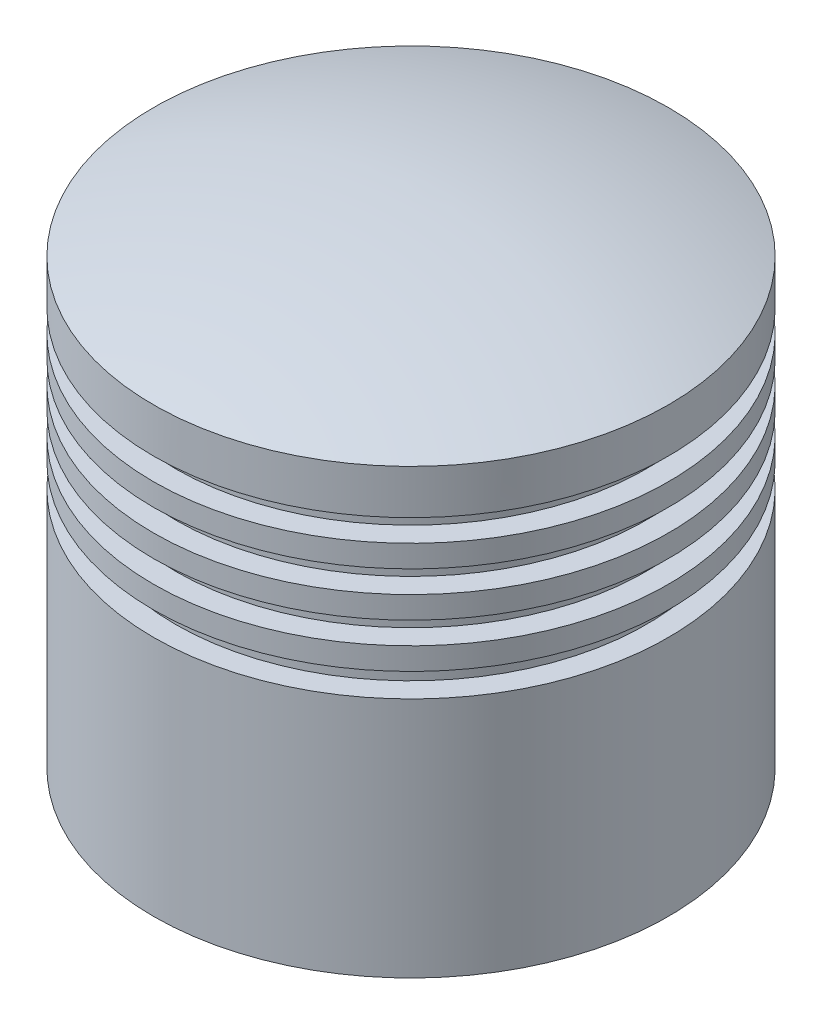
ISO-10303-21;
HEADER;
FILE_DESCRIPTION(('STEP AP214'),'2;1');
FILE_NAME('part.step','',(''),(''),'','','');
FILE_SCHEMA(('AUTOMOTIVE_DESIGN { 1 0 10303 214 1 1 1 1 }'));
ENDSEC;
DATA;
#1=APPLICATION_CONTEXT('core data for automotive mechanical design processes');
#2=APPLICATION_PROTOCOL_DEFINITION('international standard','automotive_design',2000,#1);
#3=PRODUCT_CONTEXT('',#1,'mechanical');
#4=PRODUCT('Part','Part','',(#3));
#5=PRODUCT_RELATED_PRODUCT_CATEGORY('part','',(#4));
#6=PRODUCT_DEFINITION_FORMATION('','',#4);
#7=PRODUCT_DEFINITION_CONTEXT('part definition',#1,'design');
#8=PRODUCT_DEFINITION('design','',#6,#7);
#9=PRODUCT_DEFINITION_SHAPE('','',#8);
#10=(LENGTH_UNIT() NAMED_UNIT(*) SI_UNIT(.MILLI.,.METRE.));
#11=(NAMED_UNIT(*) PLANE_ANGLE_UNIT() SI_UNIT($,.RADIAN.));
#12=(NAMED_UNIT(*) SI_UNIT($,.STERADIAN.) SOLID_ANGLE_UNIT());
#13=UNCERTAINTY_MEASURE_WITH_UNIT(LENGTH_MEASURE(1.E-05),#10,'distance_accuracy_value','');
#14=(GEOMETRIC_REPRESENTATION_CONTEXT(3) GLOBAL_UNCERTAINTY_ASSIGNED_CONTEXT((#13)) GLOBAL_UNIT_ASSIGNED_CONTEXT((#10,
#11,#12)) REPRESENTATION_CONTEXT('',''));
#15=CARTESIAN_POINT('',(0.,0.,0.));
#16=DIRECTION('',(0.,0.,1.));
#17=DIRECTION('',(1.,0.,0.));
#18=AXIS2_PLACEMENT_3D('',#15,#16,#17);
#19=CARTESIAN_POINT('',(0.,0.,0.));
#20=DIRECTION('',(0.,-1.,0.));
#21=DIRECTION('',(0.,0.,-1.));
#22=AXIS2_PLACEMENT_3D('',#19,#20,#21);
#23=CYLINDRICAL_SURFACE('',#22,50.);
#24=CARTESIAN_POINT('',(0.,0.,0.));
#25=DIRECTION('',(0.,-1.,0.));
#26=DIRECTION('',(0.,0.,-1.));
#27=AXIS2_PLACEMENT_3D('',#24,#25,#26);
#28=CIRCLE('',#27,50.);
#29=CARTESIAN_POINT('',(0.,0.,-50.));
#30=VERTEX_POINT('',#29);
#31=EDGE_CURVE('E128',#30,#30,#28,.T.);
#32=ORIENTED_EDGE('',*,*,#31,.T.);
#33=EDGE_LOOP('',(#32));
#34=FACE_BOUND('',#33,.T.);
#35=CARTESIAN_POINT('',(0.,30.,0.));
#36=DIRECTION('',(0.,-1.,0.));
#37=DIRECTION('',(0.,0.,-1.));
#38=AXIS2_PLACEMENT_3D('',#35,#36,#37);
#39=CIRCLE('',#38,50.);
#40=CARTESIAN_POINT('',(0.,30.,-50.));
#41=VERTEX_POINT('',#40);
#42=EDGE_CURVE('E10',#41,#41,#39,.T.);
#43=ORIENTED_EDGE('',*,*,#42,.F.);
#44=EDGE_LOOP('',(#43));
#45=FACE_BOUND('',#44,.T.);
#46=ADVANCED_FACE('F37',(#34,#45),#23,.F.);
#47=CARTESIAN_POINT('',(50.,30.,0.));
#48=DIRECTION('',(0.,-1.,0.));
#49=DIRECTION('',(0.,0.,-1.));
#50=AXIS2_PLACEMENT_3D('',#47,#48,#49);
#51=PLANE('',#50);
#52=ORIENTED_EDGE('',*,*,#42,.T.);
#53=EDGE_LOOP('',(#52));
#54=FACE_BOUND('',#53,.T.);
#55=CARTESIAN_POINT('',(0.,30.,0.));
#56=DIRECTION('',(0.,-1.,0.));
#57=DIRECTION('',(0.,0.,-1.));
#58=AXIS2_PLACEMENT_3D('',#55,#56,#57);
#59=CIRCLE('',#58,43.);
#60=CARTESIAN_POINT('',(0.,30.,-43.));
#61=VERTEX_POINT('',#60);
#62=EDGE_CURVE('E44',#61,#61,#59,.T.);
#63=ORIENTED_EDGE('',*,*,#62,.F.);
#64=EDGE_LOOP('',(#63));
#65=FACE_BOUND('',#64,.T.);
#66=ADVANCED_FACE('F147',(#54,#65),#51,.T.);
#67=CARTESIAN_POINT('',(0.,0.,0.));
#68=DIRECTION('',(0.,-1.,0.));
#69=DIRECTION('',(0.,0.,-1.));
#70=AXIS2_PLACEMENT_3D('',#67,#68,#69);
#71=CYLINDRICAL_SURFACE('',#70,43.);
#72=ORIENTED_EDGE('',*,*,#62,.T.);
#73=EDGE_LOOP('',(#72));
#74=FACE_BOUND('',#73,.T.);
#75=CARTESIAN_POINT('',(0.,97.2259520562684,0.));
#76=DIRECTION('',(0.,-1.,0.));
#77=DIRECTION('',(0.,0.,-1.));
#78=AXIS2_PLACEMENT_3D('',#75,#76,#77);
#79=CIRCLE('',#78,43.);
#80=CARTESIAN_POINT('',(0.,97.2259520562684,-43.));
#81=VERTEX_POINT('',#80);
#82=EDGE_CURVE('E49',#81,#81,#79,.T.);
#83=ORIENTED_EDGE('',*,*,#82,.F.);
#84=EDGE_LOOP('',(#83));
#85=FACE_BOUND('',#84,.T.);
#86=ADVANCED_FACE('F151',(#74,#85),#71,.F.);
#87=CARTESIAN_POINT('',(0.,-60.,0.));
#88=DIRECTION('',(0.,-1.,0.));
#89=DIRECTION('',(-1.,0.,0.));
#90=AXIS2_PLACEMENT_3D('',#87,#88,#89);
#91=SPHERICAL_SURFACE('',#90,163.);
#92=ORIENTED_EDGE('',*,*,#82,.T.);
#93=EDGE_LOOP('',(#92));
#94=FACE_BOUND('',#93,.T.);
#95=ADVANCED_FACE('F155',(#94),#91,.F.);
#96=CARTESIAN_POINT('',(0.,-60.,0.));
#97=DIRECTION('',(0.,-1.,0.));
#98=DIRECTION('',(1.,0.,0.));
#99=AXIS2_PLACEMENT_3D('',#96,#97,#98);
#100=SPHERICAL_SURFACE('',#99,170.);
#101=CARTESIAN_POINT('',(0.,99.7998748435054,0.));
#102=DIRECTION('',(0.,-1.,0.));
#103=DIRECTION('',(0.,0.,-1.));
#104=AXIS2_PLACEMENT_3D('',#101,#102,#103);
#105=CIRCLE('',#104,58.);
#106=CARTESIAN_POINT('',(0.,99.7998748435054,-58.));
#107=VERTEX_POINT('',#106);
#108=EDGE_CURVE('E54',#107,#107,#105,.T.);
#109=ORIENTED_EDGE('',*,*,#108,.F.);
#110=EDGE_LOOP('',(#109));
#111=FACE_BOUND('',#110,.T.);
#112=ADVANCED_FACE('F161',(#111),#100,.T.);
#113=CARTESIAN_POINT('',(0.,0.,0.));
#114=DIRECTION('',(0.,-1.,0.));
#115=DIRECTION('',(0.,0.,-1.));
#116=AXIS2_PLACEMENT_3D('',#113,#114,#115);
#117=CYLINDRICAL_SURFACE('',#116,58.);
#118=ORIENTED_EDGE('',*,*,#108,.T.);
#119=EDGE_LOOP('',(#118));
#120=FACE_BOUND('',#119,.T.);
#121=CARTESIAN_POINT('',(0.,89.7998748435054,0.));
#122=DIRECTION('',(0.,-1.,0.));
#123=DIRECTION('',(0.,0.,-1.));
#124=AXIS2_PLACEMENT_3D('',#121,#122,#123);
#125=CIRCLE('',#124,58.);
#126=CARTESIAN_POINT('',(0.,89.7998748435054,-58.));
#127=VERTEX_POINT('',#126);
#128=EDGE_CURVE('E60',#127,#127,#125,.T.);
#129=ORIENTED_EDGE('',*,*,#128,.F.);
#130=EDGE_LOOP('',(#129));
#131=FACE_BOUND('',#130,.T.);
#132=ADVANCED_FACE('F165',(#120,#131),#117,.T.);
#133=CARTESIAN_POINT('',(58.,89.7998748435054,0.));
#134=DIRECTION('',(0.,-1.,0.));
#135=DIRECTION('',(0.,0.,-1.));
#136=AXIS2_PLACEMENT_3D('',#133,#134,#135);
#137=PLANE('',#136);
#138=ORIENTED_EDGE('',*,*,#128,.T.);
#139=EDGE_LOOP('',(#138));
#140=FACE_BOUND('',#139,.T.);
#141=CARTESIAN_POINT('',(0.,89.7998748435054,0.));
#142=DIRECTION('',(0.,-1.,0.));
#143=DIRECTION('',(0.,0.,-1.));
#144=AXIS2_PLACEMENT_3D('',#141,#142,#143);
#145=CIRCLE('',#144,53.);
#146=CARTESIAN_POINT('',(0.,89.7998748435054,-53.));
#147=VERTEX_POINT('',#146);
#148=EDGE_CURVE('E64',#147,#147,#145,.T.);
#149=ORIENTED_EDGE('',*,*,#148,.F.);
#150=EDGE_LOOP('',(#149));
#151=FACE_BOUND('',#150,.T.);
#152=ADVANCED_FACE('F169',(#140,#151),#137,.T.);
#153=CARTESIAN_POINT('',(0.,0.,0.));
#154=DIRECTION('',(0.,-1.,0.));
#155=DIRECTION('',(0.,0.,-1.));
#156=AXIS2_PLACEMENT_3D('',#153,#154,#155);
#157=CYLINDRICAL_SURFACE('',#156,53.);
#158=ORIENTED_EDGE('',*,*,#148,.T.);
#159=EDGE_LOOP('',(#158));
#160=FACE_BOUND('',#159,.T.);
#161=CARTESIAN_POINT('',(0.,84.7998748435055,0.));
#162=DIRECTION('',(0.,-1.,0.));
#163=DIRECTION('',(0.,0.,-1.));
#164=AXIS2_PLACEMENT_3D('',#161,#162,#163);
#165=CIRCLE('',#164,53.);
#166=CARTESIAN_POINT('',(0.,84.7998748435055,-53.));
#167=VERTEX_POINT('',#166);
#168=EDGE_CURVE('E68',#167,#167,#165,.T.);
#169=ORIENTED_EDGE('',*,*,#168,.F.);
#170=EDGE_LOOP('',(#169));
#171=FACE_BOUND('',#170,.T.);
#172=ADVANCED_FACE('F173',(#160,#171),#157,.T.);
#173=CARTESIAN_POINT('',(53.,84.7998748435055,0.));
#174=DIRECTION('',(0.,1.,0.));
#175=DIRECTION('',(0.,0.,1.));
#176=AXIS2_PLACEMENT_3D('',#173,#174,#175);
#177=PLANE('',#176);
#178=ORIENTED_EDGE('',*,*,#168,.T.);
#179=EDGE_LOOP('',(#178));
#180=FACE_BOUND('',#179,.T.);
#181=CARTESIAN_POINT('',(0.,84.7998748435054,0.));
#182=DIRECTION('',(0.,-1.,0.));
#183=DIRECTION('',(0.,0.,-1.));
#184=AXIS2_PLACEMENT_3D('',#181,#182,#183);
#185=CIRCLE('',#184,58.);
#186=CARTESIAN_POINT('',(0.,84.7998748435054,-58.));
#187=VERTEX_POINT('',#186);
#188=EDGE_CURVE('E72',#187,#187,#185,.T.);
#189=ORIENTED_EDGE('',*,*,#188,.F.);
#190=EDGE_LOOP('',(#189));
#191=FACE_BOUND('',#190,.T.);
#192=ADVANCED_FACE('F177',(#180,#191),#177,.T.);
#193=CARTESIAN_POINT('',(0.,0.,0.));
#194=DIRECTION('',(0.,-1.,0.));
#195=DIRECTION('',(0.,0.,-1.));
#196=AXIS2_PLACEMENT_3D('',#193,#194,#195);
#197=CYLINDRICAL_SURFACE('',#196,58.);
#198=ORIENTED_EDGE('',*,*,#188,.T.);
#199=EDGE_LOOP('',(#198));
#200=FACE_BOUND('',#199,.T.);
#201=CARTESIAN_POINT('',(0.,79.7998748435054,0.));
#202=DIRECTION('',(0.,-1.,0.));
#203=DIRECTION('',(0.,0.,-1.));
#204=AXIS2_PLACEMENT_3D('',#201,#202,#203);
#205=CIRCLE('',#204,58.);
#206=CARTESIAN_POINT('',(0.,79.7998748435054,-58.));
#207=VERTEX_POINT('',#206);
#208=EDGE_CURVE('E76',#207,#207,#205,.T.);
#209=ORIENTED_EDGE('',*,*,#208,.F.);
#210=EDGE_LOOP('',(#209));
#211=FACE_BOUND('',#210,.T.);
#212=ADVANCED_FACE('F181',(#200,#211),#197,.T.);
#213=CARTESIAN_POINT('',(58.,79.7998748435054,0.));
#214=DIRECTION('',(0.,-1.,0.));
#215=DIRECTION('',(0.,0.,-1.));
#216=AXIS2_PLACEMENT_3D('',#213,#214,#215);
#217=PLANE('',#216);
#218=ORIENTED_EDGE('',*,*,#208,.T.);
#219=EDGE_LOOP('',(#218));
#220=FACE_BOUND('',#219,.T.);
#221=CARTESIAN_POINT('',(0.,79.7998748435054,0.));
#222=DIRECTION('',(0.,-1.,0.));
#223=DIRECTION('',(0.,0.,-1.));
#224=AXIS2_PLACEMENT_3D('',#221,#222,#223);
#225=CIRCLE('',#224,53.);
#226=CARTESIAN_POINT('',(0.,79.7998748435054,-53.));
#227=VERTEX_POINT('',#226);
#228=EDGE_CURVE('E80',#227,#227,#225,.T.);
#229=ORIENTED_EDGE('',*,*,#228,.F.);
#230=EDGE_LOOP('',(#229));
#231=FACE_BOUND('',#230,.T.);
#232=ADVANCED_FACE('F185',(#220,#231),#217,.T.);
#233=CARTESIAN_POINT('',(0.,0.,0.));
#234=DIRECTION('',(0.,-1.,0.));
#235=DIRECTION('',(0.,0.,-1.));
#236=AXIS2_PLACEMENT_3D('',#233,#234,#235);
#237=CYLINDRICAL_SURFACE('',#236,53.);
#238=ORIENTED_EDGE('',*,*,#228,.T.);
#239=EDGE_LOOP('',(#238));
#240=FACE_BOUND('',#239,.T.);
#241=CARTESIAN_POINT('',(0.,74.7998748435054,0.));
#242=DIRECTION('',(0.,-1.,0.));
#243=DIRECTION('',(0.,0.,-1.));
#244=AXIS2_PLACEMENT_3D('',#241,#242,#243);
#245=CIRCLE('',#244,53.);
#246=CARTESIAN_POINT('',(0.,74.7998748435054,-53.));
#247=VERTEX_POINT('',#246);
#248=EDGE_CURVE('E84',#247,#247,#245,.T.);
#249=ORIENTED_EDGE('',*,*,#248,.F.);
#250=EDGE_LOOP('',(#249));
#251=FACE_BOUND('',#250,.T.);
#252=ADVANCED_FACE('F189',(#240,#251),#237,.T.);
#253=CARTESIAN_POINT('',(53.,74.7998748435054,0.));
#254=DIRECTION('',(0.,1.,0.));
#255=DIRECTION('',(0.,0.,1.));
#256=AXIS2_PLACEMENT_3D('',#253,#254,#255);
#257=PLANE('',#256);
#258=ORIENTED_EDGE('',*,*,#248,.T.);
#259=EDGE_LOOP('',(#258));
#260=FACE_BOUND('',#259,.T.);
#261=CARTESIAN_POINT('',(0.,74.7998748435054,0.));
#262=DIRECTION('',(0.,-1.,0.));
#263=DIRECTION('',(0.,0.,-1.));
#264=AXIS2_PLACEMENT_3D('',#261,#262,#263);
#265=CIRCLE('',#264,58.);
#266=CARTESIAN_POINT('',(0.,74.7998748435054,-58.));
#267=VERTEX_POINT('',#266);
#268=EDGE_CURVE('E88',#267,#267,#265,.T.);
#269=ORIENTED_EDGE('',*,*,#268,.F.);
#270=EDGE_LOOP('',(#269));
#271=FACE_BOUND('',#270,.T.);
#272=ADVANCED_FACE('F193',(#260,#271),#257,.T.);
#273=CARTESIAN_POINT('',(0.,0.,0.));
#274=DIRECTION('',(0.,-1.,0.));
#275=DIRECTION('',(0.,0.,-1.));
#276=AXIS2_PLACEMENT_3D('',#273,#274,#275);
#277=CYLINDRICAL_SURFACE('',#276,58.);
#278=ORIENTED_EDGE('',*,*,#268,.T.);
#279=EDGE_LOOP('',(#278));
#280=FACE_BOUND('',#279,.T.);
#281=CARTESIAN_POINT('',(0.,69.7998748435054,0.));
#282=DIRECTION('',(0.,-1.,0.));
#283=DIRECTION('',(0.,0.,-1.));
#284=AXIS2_PLACEMENT_3D('',#281,#282,#283);
#285=CIRCLE('',#284,58.);
#286=CARTESIAN_POINT('',(0.,69.7998748435054,-58.));
#287=VERTEX_POINT('',#286);
#288=EDGE_CURVE('E92',#287,#287,#285,.T.);
#289=ORIENTED_EDGE('',*,*,#288,.F.);
#290=EDGE_LOOP('',(#289));
#291=FACE_BOUND('',#290,.T.);
#292=ADVANCED_FACE('F197',(#280,#291),#277,.T.);
#293=CARTESIAN_POINT('',(58.,69.7998748435054,0.));
#294=DIRECTION('',(0.,-1.,0.));
#295=DIRECTION('',(0.,0.,-1.));
#296=AXIS2_PLACEMENT_3D('',#293,#294,#295);
#297=PLANE('',#296);
#298=ORIENTED_EDGE('',*,*,#288,.T.);
#299=EDGE_LOOP('',(#298));
#300=FACE_BOUND('',#299,.T.);
#301=CARTESIAN_POINT('',(0.,69.7998748435054,0.));
#302=DIRECTION('',(0.,-1.,0.));
#303=DIRECTION('',(0.,0.,-1.));
#304=AXIS2_PLACEMENT_3D('',#301,#302,#303);
#305=CIRCLE('',#304,53.);
#306=CARTESIAN_POINT('',(0.,69.7998748435054,-53.));
#307=VERTEX_POINT('',#306);
#308=EDGE_CURVE('E96',#307,#307,#305,.T.);
#309=ORIENTED_EDGE('',*,*,#308,.F.);
#310=EDGE_LOOP('',(#309));
#311=FACE_BOUND('',#310,.T.);
#312=ADVANCED_FACE('F201',(#300,#311),#297,.T.);
#313=CARTESIAN_POINT('',(0.,0.,0.));
#314=DIRECTION('',(0.,-1.,0.));
#315=DIRECTION('',(0.,0.,-1.));
#316=AXIS2_PLACEMENT_3D('',#313,#314,#315);
#317=CYLINDRICAL_SURFACE('',#316,53.);
#318=ORIENTED_EDGE('',*,*,#308,.T.);
#319=EDGE_LOOP('',(#318));
#320=FACE_BOUND('',#319,.T.);
#321=CARTESIAN_POINT('',(0.,64.7998748435054,0.));
#322=DIRECTION('',(0.,-1.,0.));
#323=DIRECTION('',(0.,0.,-1.));
#324=AXIS2_PLACEMENT_3D('',#321,#322,#323);
#325=CIRCLE('',#324,53.);
#326=CARTESIAN_POINT('',(0.,64.7998748435054,-53.));
#327=VERTEX_POINT('',#326);
#328=EDGE_CURVE('E100',#327,#327,#325,.T.);
#329=ORIENTED_EDGE('',*,*,#328,.F.);
#330=EDGE_LOOP('',(#329));
#331=FACE_BOUND('',#330,.T.);
#332=ADVANCED_FACE('F205',(#320,#331),#317,.T.);
#333=CARTESIAN_POINT('',(53.,64.7998748435054,0.));
#334=DIRECTION('',(0.,1.,0.));
#335=DIRECTION('',(0.,0.,1.));
#336=AXIS2_PLACEMENT_3D('',#333,#334,#335);
#337=PLANE('',#336);
#338=ORIENTED_EDGE('',*,*,#328,.T.);
#339=EDGE_LOOP('',(#338));
#340=FACE_BOUND('',#339,.T.);
#341=CARTESIAN_POINT('',(0.,64.7998748435054,0.));
#342=DIRECTION('',(0.,-1.,0.));
#343=DIRECTION('',(0.,0.,-1.));
#344=AXIS2_PLACEMENT_3D('',#341,#342,#343);
#345=CIRCLE('',#344,58.);
#346=CARTESIAN_POINT('',(0.,64.7998748435054,-58.));
#347=VERTEX_POINT('',#346);
#348=EDGE_CURVE('E104',#347,#347,#345,.T.);
#349=ORIENTED_EDGE('',*,*,#348,.F.);
#350=EDGE_LOOP('',(#349));
#351=FACE_BOUND('',#350,.T.);
#352=ADVANCED_FACE('F209',(#340,#351),#337,.T.);
#353=CARTESIAN_POINT('',(0.,0.,0.));
#354=DIRECTION('',(0.,-1.,0.));
#355=DIRECTION('',(0.,0.,-1.));
#356=AXIS2_PLACEMENT_3D('',#353,#354,#355);
#357=CYLINDRICAL_SURFACE('',#356,58.);
#358=ORIENTED_EDGE('',*,*,#348,.T.);
#359=EDGE_LOOP('',(#358));
#360=FACE_BOUND('',#359,.T.);
#361=CARTESIAN_POINT('',(0.,59.7998748435054,0.));
#362=DIRECTION('',(0.,-1.,0.));
#363=DIRECTION('',(0.,0.,-1.));
#364=AXIS2_PLACEMENT_3D('',#361,#362,#363);
#365=CIRCLE('',#364,58.);
#366=CARTESIAN_POINT('',(0.,59.7998748435054,-58.));
#367=VERTEX_POINT('',#366);
#368=EDGE_CURVE('E108',#367,#367,#365,.T.);
#369=ORIENTED_EDGE('',*,*,#368,.F.);
#370=EDGE_LOOP('',(#369));
#371=FACE_BOUND('',#370,.T.);
#372=ADVANCED_FACE('F213',(#360,#371),#357,.T.);
#373=CARTESIAN_POINT('',(58.,59.7998748435054,0.));
#374=DIRECTION('',(0.,-1.,0.));
#375=DIRECTION('',(0.,0.,-1.));
#376=AXIS2_PLACEMENT_3D('',#373,#374,#375);
#377=PLANE('',#376);
#378=ORIENTED_EDGE('',*,*,#368,.T.);
#379=EDGE_LOOP('',(#378));
#380=FACE_BOUND('',#379,.T.);
#381=CARTESIAN_POINT('',(0.,59.7998748435054,0.));
#382=DIRECTION('',(0.,-1.,0.));
#383=DIRECTION('',(0.,0.,-1.));
#384=AXIS2_PLACEMENT_3D('',#381,#382,#383);
#385=CIRCLE('',#384,53.);
#386=CARTESIAN_POINT('',(0.,59.7998748435054,-53.));
#387=VERTEX_POINT('',#386);
#388=EDGE_CURVE('E112',#387,#387,#385,.T.);
#389=ORIENTED_EDGE('',*,*,#388,.F.);
#390=EDGE_LOOP('',(#389));
#391=FACE_BOUND('',#390,.T.);
#392=ADVANCED_FACE('F217',(#380,#391),#377,.T.);
#393=CARTESIAN_POINT('',(0.,0.,0.));
#394=DIRECTION('',(0.,-1.,0.));
#395=DIRECTION('',(0.,0.,-1.));
#396=AXIS2_PLACEMENT_3D('',#393,#394,#395);
#397=CYLINDRICAL_SURFACE('',#396,53.);
#398=ORIENTED_EDGE('',*,*,#388,.T.);
#399=EDGE_LOOP('',(#398));
#400=FACE_BOUND('',#399,.T.);
#401=CARTESIAN_POINT('',(0.,54.4377691774765,0.));
#402=DIRECTION('',(0.,-1.,0.));
#403=DIRECTION('',(0.,0.,-1.));
#404=AXIS2_PLACEMENT_3D('',#401,#402,#403);
#405=CIRCLE('',#404,53.);
#406=CARTESIAN_POINT('',(0.,54.4377691774765,-53.));
#407=VERTEX_POINT('',#406);
#408=EDGE_CURVE('E116',#407,#407,#405,.T.);
#409=ORIENTED_EDGE('',*,*,#408,.F.);
#410=EDGE_LOOP('',(#409));
#411=FACE_BOUND('',#410,.T.);
#412=ADVANCED_FACE('F221',(#400,#411),#397,.T.);
#413=CARTESIAN_POINT('',(53.,54.4377691774765,0.));
#414=DIRECTION('',(0.,1.,0.));
#415=DIRECTION('',(0.,0.,1.));
#416=AXIS2_PLACEMENT_3D('',#413,#414,#415);
#417=PLANE('',#416);
#418=ORIENTED_EDGE('',*,*,#408,.T.);
#419=EDGE_LOOP('',(#418));
#420=FACE_BOUND('',#419,.T.);
#421=CARTESIAN_POINT('',(0.,54.4377691774765,0.));
#422=DIRECTION('',(0.,-1.,0.));
#423=DIRECTION('',(0.,0.,-1.));
#424=AXIS2_PLACEMENT_3D('',#421,#422,#423);
#425=CIRCLE('',#424,58.);
#426=CARTESIAN_POINT('',(0.,54.4377691774765,-58.));
#427=VERTEX_POINT('',#426);
#428=EDGE_CURVE('E120',#427,#427,#425,.T.);
#429=ORIENTED_EDGE('',*,*,#428,.F.);
#430=EDGE_LOOP('',(#429));
#431=FACE_BOUND('',#430,.T.);
#432=ADVANCED_FACE('F143',(#420,#431),#417,.T.);
#433=CARTESIAN_POINT('',(0.,0.,0.));
#434=DIRECTION('',(0.,-1.,0.));
#435=DIRECTION('',(0.,0.,-1.));
#436=AXIS2_PLACEMENT_3D('',#433,#434,#435);
#437=CYLINDRICAL_SURFACE('',#436,58.);
#438=ORIENTED_EDGE('',*,*,#428,.T.);
#439=EDGE_LOOP('',(#438));
#440=FACE_BOUND('',#439,.T.);
#441=CARTESIAN_POINT('',(0.,0.,0.));
#442=DIRECTION('',(0.,-1.,0.));
#443=DIRECTION('',(0.,0.,-1.));
#444=AXIS2_PLACEMENT_3D('',#441,#442,#443);
#445=CIRCLE('',#444,58.);
#446=CARTESIAN_POINT('',(0.,0.,-58.));
#447=VERTEX_POINT('',#446);
#448=EDGE_CURVE('E124',#447,#447,#445,.T.);
#449=ORIENTED_EDGE('',*,*,#448,.F.);
#450=EDGE_LOOP('',(#449));
#451=FACE_BOUND('',#450,.T.);
#452=ADVANCED_FACE('F137',(#440,#451),#437,.T.);
#453=CARTESIAN_POINT('',(50.,0.,0.));
#454=DIRECTION('',(0.,-1.,0.));
#455=DIRECTION('',(0.,0.,-1.));
#456=AXIS2_PLACEMENT_3D('',#453,#454,#455);
#457=PLANE('',#456);
#458=ORIENTED_EDGE('',*,*,#448,.T.);
#459=EDGE_LOOP('',(#458));
#460=FACE_BOUND('',#459,.T.);
#461=ORIENTED_EDGE('',*,*,#31,.F.);
#462=EDGE_LOOP('',(#461));
#463=FACE_BOUND('',#462,.T.);
#464=ADVANCED_FACE('F135',(#460,#463),#457,.T.);
#465=CLOSED_SHELL('',(#46,#66,#86,#95,#112,#132,#152,#172,#192,#212,#232,#252,#272,#292,#312,
#332,#352,#372,#392,#412,#432,#452,#464));
#466=MANIFOLD_SOLID_BREP('B2',#465);
#467=ADVANCED_BREP_SHAPE_REPRESENTATION('',(#18,#466),#14);
#468=SHAPE_DEFINITION_REPRESENTATION(#9,#467);
ENDSEC;
END-ISO-10303-21;
